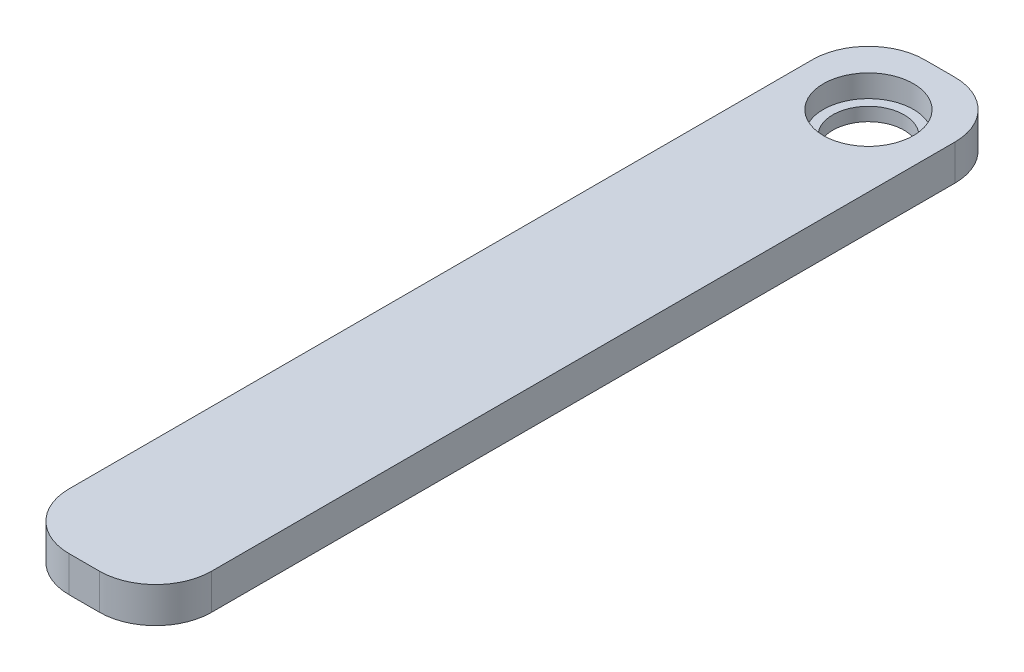
ISO-10303-21;
HEADER;
FILE_DESCRIPTION(('STEP AP214'),'2;1');
FILE_NAME('part.step','',(''),(''),'','','');
FILE_SCHEMA(('AUTOMOTIVE_DESIGN { 1 0 10303 214 1 1 1 1 }'));
ENDSEC;
DATA;
#1=APPLICATION_CONTEXT('core data for automotive mechanical design processes');
#2=APPLICATION_PROTOCOL_DEFINITION('international standard','automotive_design',2000,#1);
#3=PRODUCT_CONTEXT('',#1,'mechanical');
#4=PRODUCT('Part','Part','',(#3));
#5=PRODUCT_RELATED_PRODUCT_CATEGORY('part','',(#4));
#6=PRODUCT_DEFINITION_FORMATION('','',#4);
#7=PRODUCT_DEFINITION_CONTEXT('part definition',#1,'design');
#8=PRODUCT_DEFINITION('design','',#6,#7);
#9=PRODUCT_DEFINITION_SHAPE('','',#8);
#10=(LENGTH_UNIT() NAMED_UNIT(*) SI_UNIT(.MILLI.,.METRE.));
#11=(NAMED_UNIT(*) PLANE_ANGLE_UNIT() SI_UNIT($,.RADIAN.));
#12=(NAMED_UNIT(*) SI_UNIT($,.STERADIAN.) SOLID_ANGLE_UNIT());
#13=UNCERTAINTY_MEASURE_WITH_UNIT(LENGTH_MEASURE(1.E-05),#10,'distance_accuracy_value','');
#14=(GEOMETRIC_REPRESENTATION_CONTEXT(3) GLOBAL_UNCERTAINTY_ASSIGNED_CONTEXT((#13)) GLOBAL_UNIT_ASSIGNED_CONTEXT((#10,
#11,#12)) REPRESENTATION_CONTEXT('',''));
#15=CARTESIAN_POINT('',(0.,0.,0.));
#16=DIRECTION('',(0.,0.,1.));
#17=DIRECTION('',(1.,0.,0.));
#18=AXIS2_PLACEMENT_3D('',#15,#16,#17);
#19=CARTESIAN_POINT('',(0.,6.35,0.));
#20=DIRECTION('',(1.,0.,0.));
#21=DIRECTION('',(0.,0.,-1.));
#22=AXIS2_PLACEMENT_3D('',#19,#20,#21);
#23=PLANE('',#22);
#24=DIRECTION('',(0.,0.,1.));
#25=VECTOR('',#24,1.);
#26=CARTESIAN_POINT('',(0.,0.,0.));
#27=LINE('',#26,#25);
#28=CARTESIAN_POINT('',(0.,0.,-142.4));
#29=VERTEX_POINT('',#28);
#30=CARTESIAN_POINT('',(0.,0.,-9.99999999999999));
#31=VERTEX_POINT('',#30);
#32=EDGE_CURVE('E184',#29,#31,#27,.T.);
#33=ORIENTED_EDGE('',*,*,#32,.T.);
#34=DIRECTION('',(0.,-1.,0.));
#35=VECTOR('',#34,1.);
#36=CARTESIAN_POINT('',(0.,6.35,-10.));
#37=LINE('',#36,#35);
#38=CARTESIAN_POINT('',(0.,6.35,-9.99999999999999));
#39=VERTEX_POINT('',#38);
#40=EDGE_CURVE('E150',#31,#39,#37,.F.);
#41=ORIENTED_EDGE('',*,*,#40,.T.);
#42=DIRECTION('',(0.,0.,1.));
#43=VECTOR('',#42,1.);
#44=CARTESIAN_POINT('',(0.,6.35,0.));
#45=LINE('',#44,#43);
#46=CARTESIAN_POINT('',(0.,6.35,-142.4));
#47=VERTEX_POINT('',#46);
#48=EDGE_CURVE('E182',#47,#39,#45,.T.);
#49=ORIENTED_EDGE('',*,*,#48,.F.);
#50=DIRECTION('',(0.,-1.,0.));
#51=VECTOR('',#50,1.);
#52=CARTESIAN_POINT('',(0.,6.35,-142.4));
#53=LINE('',#52,#51);
#54=EDGE_CURVE('E147',#47,#29,#53,.T.);
#55=ORIENTED_EDGE('',*,*,#54,.T.);
#56=EDGE_LOOP('',(#33,#41,#49,#55));
#57=FACE_BOUND('',#56,.T.);
#58=ADVANCED_FACE('F35',(#57),#23,.F.);
#59=CARTESIAN_POINT('',(0.,6.35,0.));
#60=DIRECTION('',(0.,0.,-1.));
#61=DIRECTION('',(-1.,0.,0.));
#62=AXIS2_PLACEMENT_3D('',#59,#60,#61);
#63=PLANE('',#62);
#64=DIRECTION('',(1.,0.,0.));
#65=VECTOR('',#64,1.);
#66=CARTESIAN_POINT('',(0.,6.35,0.));
#67=LINE('',#66,#65);
#68=CARTESIAN_POINT('',(10.,6.35,0.));
#69=VERTEX_POINT('',#68);
#70=CARTESIAN_POINT('',(15.4,6.35,0.));
#71=VERTEX_POINT('',#70);
#72=EDGE_CURVE('E193',#69,#71,#67,.T.);
#73=ORIENTED_EDGE('',*,*,#72,.F.);
#74=DIRECTION('',(0.,-1.,0.));
#75=VECTOR('',#74,1.);
#76=CARTESIAN_POINT('',(10.,6.35,0.));
#77=LINE('',#76,#75);
#78=CARTESIAN_POINT('',(10.,0.,0.));
#79=VERTEX_POINT('',#78);
#80=EDGE_CURVE('E133',#69,#79,#77,.T.);
#81=ORIENTED_EDGE('',*,*,#80,.T.);
#82=DIRECTION('',(1.,0.,0.));
#83=VECTOR('',#82,1.);
#84=CARTESIAN_POINT('',(0.,0.,0.));
#85=LINE('',#84,#83);
#86=CARTESIAN_POINT('',(15.4,0.,0.));
#87=VERTEX_POINT('',#86);
#88=EDGE_CURVE('E180',#79,#87,#85,.T.);
#89=ORIENTED_EDGE('',*,*,#88,.T.);
#90=DIRECTION('',(0.,-1.,0.));
#91=VECTOR('',#90,1.);
#92=CARTESIAN_POINT('',(15.4,6.35,0.));
#93=LINE('',#92,#91);
#94=EDGE_CURVE('E131',#87,#71,#93,.F.);
#95=ORIENTED_EDGE('',*,*,#94,.T.);
#96=EDGE_LOOP('',(#73,#81,#89,#95));
#97=FACE_BOUND('',#96,.T.);
#98=ADVANCED_FACE('F222',(#97),#63,.F.);
#99=CARTESIAN_POINT('',(25.4,6.35,0.));
#100=DIRECTION('',(-1.,0.,0.));
#101=DIRECTION('',(0.,0.,1.));
#102=AXIS2_PLACEMENT_3D('',#99,#100,#101);
#103=PLANE('',#102);
#104=DIRECTION('',(0.,0.,-1.));
#105=VECTOR('',#104,1.);
#106=CARTESIAN_POINT('',(25.4,6.35,0.));
#107=LINE('',#106,#105);
#108=CARTESIAN_POINT('',(25.4,6.35,-10.));
#109=VERTEX_POINT('',#108);
#110=CARTESIAN_POINT('',(25.4,6.35,-142.4));
#111=VERTEX_POINT('',#110);
#112=EDGE_CURVE('E171',#109,#111,#107,.T.);
#113=ORIENTED_EDGE('',*,*,#112,.F.);
#114=DIRECTION('',(0.,-1.,0.));
#115=VECTOR('',#114,1.);
#116=CARTESIAN_POINT('',(25.4,6.35,-10.));
#117=LINE('',#116,#115);
#118=CARTESIAN_POINT('',(25.4,0.,-10.));
#119=VERTEX_POINT('',#118);
#120=EDGE_CURVE('E161',#109,#119,#117,.T.);
#121=ORIENTED_EDGE('',*,*,#120,.T.);
#122=DIRECTION('',(0.,0.,-1.));
#123=VECTOR('',#122,1.);
#124=CARTESIAN_POINT('',(25.4,0.,0.));
#125=LINE('',#124,#123);
#126=CARTESIAN_POINT('',(25.4,0.,-142.4));
#127=VERTEX_POINT('',#126);
#128=EDGE_CURVE('E169',#119,#127,#125,.T.);
#129=ORIENTED_EDGE('',*,*,#128,.T.);
#130=DIRECTION('',(0.,-1.,0.));
#131=VECTOR('',#130,1.);
#132=CARTESIAN_POINT('',(25.4,6.35,-142.4));
#133=LINE('',#132,#131);
#134=EDGE_CURVE('E159',#127,#111,#133,.F.);
#135=ORIENTED_EDGE('',*,*,#134,.T.);
#136=EDGE_LOOP('',(#113,#121,#129,#135));
#137=FACE_BOUND('',#136,.T.);
#138=ADVANCED_FACE('F168',(#137),#103,.F.);
#139=CARTESIAN_POINT('',(0.,6.35,-152.4));
#140=DIRECTION('',(0.,0.,1.));
#141=DIRECTION('',(1.,0.,0.));
#142=AXIS2_PLACEMENT_3D('',#139,#140,#141);
#143=PLANE('',#142);
#144=DIRECTION('',(-1.,0.,0.));
#145=VECTOR('',#144,1.);
#146=CARTESIAN_POINT('',(0.,6.35,-152.4));
#147=LINE('',#146,#145);
#148=CARTESIAN_POINT('',(15.4,6.35,-152.4));
#149=VERTEX_POINT('',#148);
#150=CARTESIAN_POINT('',(9.99999999999997,6.35,-152.4));
#151=VERTEX_POINT('',#150);
#152=EDGE_CURVE('E190',#149,#151,#147,.T.);
#153=ORIENTED_EDGE('',*,*,#152,.F.);
#154=DIRECTION('',(0.,-1.,0.));
#155=VECTOR('',#154,1.);
#156=CARTESIAN_POINT('',(15.4,6.35,-152.4));
#157=LINE('',#156,#155);
#158=CARTESIAN_POINT('',(15.4,0.,-152.4));
#159=VERTEX_POINT('',#158);
#160=EDGE_CURVE('E11',#149,#159,#157,.T.);
#161=ORIENTED_EDGE('',*,*,#160,.T.);
#162=DIRECTION('',(-1.,0.,0.));
#163=VECTOR('',#162,1.);
#164=CARTESIAN_POINT('',(0.,0.,-152.4));
#165=LINE('',#164,#163);
#166=CARTESIAN_POINT('',(9.99999999999997,0.,-152.4));
#167=VERTEX_POINT('',#166);
#168=EDGE_CURVE('E179',#159,#167,#165,.T.);
#169=ORIENTED_EDGE('',*,*,#168,.T.);
#170=DIRECTION('',(0.,-1.,0.));
#171=VECTOR('',#170,1.);
#172=CARTESIAN_POINT('',(9.99999999999997,6.35,-152.4));
#173=LINE('',#172,#171);
#174=EDGE_CURVE('E43',#167,#151,#173,.F.);
#175=ORIENTED_EDGE('',*,*,#174,.T.);
#176=EDGE_LOOP('',(#153,#161,#169,#175));
#177=FACE_BOUND('',#176,.T.);
#178=ADVANCED_FACE('F228',(#177),#143,.F.);
#179=CARTESIAN_POINT('',(0.,6.35,0.));
#180=DIRECTION('',(0.,-1.,0.));
#181=DIRECTION('',(0.,0.,-1.));
#182=AXIS2_PLACEMENT_3D('',#179,#180,#181);
#183=PLANE('',#182);
#184=ORIENTED_EDGE('',*,*,#48,.T.);
#185=CARTESIAN_POINT('',(10.,6.35,-10.));
#186=DIRECTION('',(0.,-1.,0.));
#187=DIRECTION('',(0.,0.,-1.));
#188=AXIS2_PLACEMENT_3D('',#185,#186,#187);
#189=CIRCLE('',#188,10.);
#190=EDGE_CURVE('E157',#39,#69,#189,.F.);
#191=ORIENTED_EDGE('',*,*,#190,.T.);
#192=ORIENTED_EDGE('',*,*,#72,.T.);
#193=CARTESIAN_POINT('',(15.4,6.35,-10.));
#194=DIRECTION('',(0.,-1.,0.));
#195=DIRECTION('',(0.,0.,-1.));
#196=AXIS2_PLACEMENT_3D('',#193,#194,#195);
#197=CIRCLE('',#196,10.);
#198=EDGE_CURVE('E155',#71,#109,#197,.F.);
#199=ORIENTED_EDGE('',*,*,#198,.T.);
#200=ORIENTED_EDGE('',*,*,#112,.T.);
#201=CARTESIAN_POINT('',(15.4,6.35,-142.4));
#202=DIRECTION('',(0.,-1.,0.));
#203=DIRECTION('',(0.,0.,-1.));
#204=AXIS2_PLACEMENT_3D('',#201,#202,#203);
#205=CIRCLE('',#204,10.);
#206=EDGE_CURVE('E56',#111,#149,#205,.F.);
#207=ORIENTED_EDGE('',*,*,#206,.T.);
#208=ORIENTED_EDGE('',*,*,#152,.T.);
#209=CARTESIAN_POINT('',(9.99999999999997,6.35,-142.4));
#210=DIRECTION('',(0.,-1.,0.));
#211=DIRECTION('',(0.,0.,-1.));
#212=AXIS2_PLACEMENT_3D('',#209,#210,#211);
#213=CIRCLE('',#212,10.);
#214=EDGE_CURVE('E152',#151,#47,#213,.F.);
#215=ORIENTED_EDGE('',*,*,#214,.T.);
#216=EDGE_LOOP('',(#184,#191,#192,#199,#200,#207,#208,#215));
#217=FACE_BOUND('',#216,.T.);
#218=CARTESIAN_POINT('',(12.7,6.35,-139.7));
#219=DIRECTION('',(0.,1.,0.));
#220=DIRECTION('',(0.,0.,1.));
#221=AXIS2_PLACEMENT_3D('',#218,#219,#220);
#222=CIRCLE('',#221,8.016875);
#223=CARTESIAN_POINT('',(12.7,6.35,-131.683125));
#224=VERTEX_POINT('',#223);
#225=EDGE_CURVE('E202',#224,#224,#222,.T.);
#226=ORIENTED_EDGE('',*,*,#225,.F.);
#227=EDGE_LOOP('',(#226));
#228=FACE_BOUND('',#227,.T.);
#229=ADVANCED_FACE('F215',(#217,#228),#183,.F.);
#230=CARTESIAN_POINT('',(0.,0.,0.));
#231=DIRECTION('',(0.,-1.,0.));
#232=DIRECTION('',(0.,0.,-1.));
#233=AXIS2_PLACEMENT_3D('',#230,#231,#232);
#234=PLANE('',#233);
#235=CARTESIAN_POINT('',(12.7,0.,-6.35));
#236=DIRECTION('',(0.,-1.,0.));
#237=DIRECTION('',(0.,0.,-1.));
#238=AXIS2_PLACEMENT_3D('',#235,#236,#237);
#239=CIRCLE('',#238,3.429);
#240=CARTESIAN_POINT('',(15.1611800503011,0.,-8.7376));
#241=VERTEX_POINT('',#240);
#242=CARTESIAN_POINT('',(10.2388199496989,0.,-8.7376));
#243=VERTEX_POINT('',#242);
#244=EDGE_CURVE('E188',#241,#243,#239,.T.);
#245=ORIENTED_EDGE('',*,*,#244,.F.);
#246=DIRECTION('',(1.,0.,0.));
#247=VECTOR('',#246,1.);
#248=CARTESIAN_POINT('',(17.9251449243623,0.,-8.7376));
#249=LINE('',#248,#247);
#250=EDGE_CURVE('E120',#243,#241,#249,.T.);
#251=ORIENTED_EDGE('',*,*,#250,.F.);
#252=EDGE_LOOP('',(#245,#251));
#253=FACE_BOUND('',#252,.T.);
#254=CARTESIAN_POINT('',(12.7,0.,-139.7));
#255=DIRECTION('',(0.,1.,0.));
#256=DIRECTION('',(0.,0.,1.));
#257=AXIS2_PLACEMENT_3D('',#254,#255,#256);
#258=CIRCLE('',#257,6.35);
#259=CARTESIAN_POINT('',(12.7,0.,-133.35));
#260=VERTEX_POINT('',#259);
#261=EDGE_CURVE('E207',#260,#260,#258,.T.);
#262=ORIENTED_EDGE('',*,*,#261,.T.);
#263=EDGE_LOOP('',(#262));
#264=FACE_BOUND('',#263,.T.);
#265=ORIENTED_EDGE('',*,*,#88,.F.);
#266=CARTESIAN_POINT('',(10.,0.,-10.));
#267=DIRECTION('',(0.,-1.,0.));
#268=DIRECTION('',(0.,0.,-1.));
#269=AXIS2_PLACEMENT_3D('',#266,#267,#268);
#270=CIRCLE('',#269,10.);
#271=EDGE_CURVE('E145',#79,#31,#270,.T.);
#272=ORIENTED_EDGE('',*,*,#271,.T.);
#273=ORIENTED_EDGE('',*,*,#32,.F.);
#274=CARTESIAN_POINT('',(9.99999999999997,0.,-142.4));
#275=DIRECTION('',(0.,-1.,0.));
#276=DIRECTION('',(0.,0.,-1.));
#277=AXIS2_PLACEMENT_3D('',#274,#275,#276);
#278=CIRCLE('',#277,10.);
#279=EDGE_CURVE('E139',#29,#167,#278,.T.);
#280=ORIENTED_EDGE('',*,*,#279,.T.);
#281=ORIENTED_EDGE('',*,*,#168,.F.);
#282=CARTESIAN_POINT('',(15.4,0.,-142.4));
#283=DIRECTION('',(0.,-1.,0.));
#284=DIRECTION('',(0.,0.,-1.));
#285=AXIS2_PLACEMENT_3D('',#282,#283,#284);
#286=CIRCLE('',#285,10.);
#287=EDGE_CURVE('E141',#159,#127,#286,.T.);
#288=ORIENTED_EDGE('',*,*,#287,.T.);
#289=ORIENTED_EDGE('',*,*,#128,.F.);
#290=CARTESIAN_POINT('',(15.4,0.,-10.));
#291=DIRECTION('',(0.,-1.,0.));
#292=DIRECTION('',(0.,0.,-1.));
#293=AXIS2_PLACEMENT_3D('',#290,#291,#292);
#294=CIRCLE('',#293,10.);
#295=EDGE_CURVE('E143',#119,#87,#294,.T.);
#296=ORIENTED_EDGE('',*,*,#295,.T.);
#297=EDGE_LOOP('',(#265,#272,#273,#280,#281,#288,#289,#296));
#298=FACE_BOUND('',#297,.T.);
#299=ADVANCED_FACE('F176',(#253,#264,#298),#234,.T.);
#300=CARTESIAN_POINT('',(12.7,2.38125,-139.7));
#301=DIRECTION('',(0.,1.,0.));
#302=DIRECTION('',(0.,0.,1.));
#303=AXIS2_PLACEMENT_3D('',#300,#301,#302);
#304=CYLINDRICAL_SURFACE('',#303,8.016875);
#305=CARTESIAN_POINT('',(12.7,2.38125,-139.7));
#306=DIRECTION('',(0.,1.,0.));
#307=DIRECTION('',(0.,0.,1.));
#308=AXIS2_PLACEMENT_3D('',#305,#306,#307);
#309=CIRCLE('',#308,8.016875);
#310=CARTESIAN_POINT('',(12.7,2.38125,-131.683125));
#311=VERTEX_POINT('',#310);
#312=EDGE_CURVE('E197',#311,#311,#309,.T.);
#313=ORIENTED_EDGE('',*,*,#312,.F.);
#314=EDGE_LOOP('',(#313));
#315=FACE_BOUND('',#314,.T.);
#316=ORIENTED_EDGE('',*,*,#225,.T.);
#317=EDGE_LOOP('',(#316));
#318=FACE_BOUND('',#317,.T.);
#319=ADVANCED_FACE('F265',(#315,#318),#304,.F.);
#320=CARTESIAN_POINT('',(12.7,2.38125,-139.7));
#321=DIRECTION('',(0.,1.,0.));
#322=DIRECTION('',(0.,0.,1.));
#323=AXIS2_PLACEMENT_3D('',#320,#321,#322);
#324=PLANE('',#323);
#325=CARTESIAN_POINT('',(12.7,2.38125,-139.7));
#326=DIRECTION('',(0.,1.,0.));
#327=DIRECTION('',(0.,0.,1.));
#328=AXIS2_PLACEMENT_3D('',#325,#326,#327);
#329=CIRCLE('',#328,6.35);
#330=CARTESIAN_POINT('',(12.7,2.38125,-133.35));
#331=VERTEX_POINT('',#330);
#332=EDGE_CURVE('E189',#331,#331,#329,.T.);
#333=ORIENTED_EDGE('',*,*,#332,.F.);
#334=EDGE_LOOP('',(#333));
#335=FACE_BOUND('',#334,.T.);
#336=ORIENTED_EDGE('',*,*,#312,.T.);
#337=EDGE_LOOP('',(#336));
#338=FACE_BOUND('',#337,.T.);
#339=ADVANCED_FACE('F261',(#335,#338),#324,.T.);
#340=CARTESIAN_POINT('',(12.7,0.,-139.7));
#341=DIRECTION('',(0.,1.,0.));
#342=DIRECTION('',(0.,0.,1.));
#343=AXIS2_PLACEMENT_3D('',#340,#341,#342);
#344=CYLINDRICAL_SURFACE('',#343,6.35);
#345=ORIENTED_EDGE('',*,*,#261,.F.);
#346=EDGE_LOOP('',(#345));
#347=FACE_BOUND('',#346,.T.);
#348=ORIENTED_EDGE('',*,*,#332,.T.);
#349=EDGE_LOOP('',(#348));
#350=FACE_BOUND('',#349,.T.);
#351=ADVANCED_FACE('F258',(#347,#350),#344,.F.);
#352=CARTESIAN_POINT('',(12.7,-1.27,-6.35));
#353=DIRECTION('',(0.,1.,0.));
#354=DIRECTION('',(0.,0.,1.));
#355=AXIS2_PLACEMENT_3D('',#352,#353,#354);
#356=CYLINDRICAL_SURFACE('',#355,3.429);
#357=DIRECTION('',(0.,1.,0.));
#358=VECTOR('',#357,1.);
#359=CARTESIAN_POINT('',(10.2388199496989,-1.27,-8.7376));
#360=LINE('',#359,#358);
#361=CARTESIAN_POINT('',(10.2388199496989,5.08,-8.7376));
#362=VERTEX_POINT('',#361);
#363=EDGE_CURVE('E123',#243,#362,#360,.T.);
#364=ORIENTED_EDGE('',*,*,#363,.T.);
#365=CARTESIAN_POINT('',(12.7,5.08,-6.35));
#366=DIRECTION('',(0.,-1.,0.));
#367=DIRECTION('',(0.,0.,-1.));
#368=AXIS2_PLACEMENT_3D('',#365,#366,#367);
#369=CIRCLE('',#368,3.429);
#370=CARTESIAN_POINT('',(15.1611800503011,5.08,-8.7376));
#371=VERTEX_POINT('',#370);
#372=EDGE_CURVE('E126',#362,#371,#369,.F.);
#373=ORIENTED_EDGE('',*,*,#372,.T.);
#374=DIRECTION('',(0.,1.,0.));
#375=VECTOR('',#374,1.);
#376=CARTESIAN_POINT('',(15.1611800503011,-1.27,-8.7376));
#377=LINE('',#376,#375);
#378=EDGE_CURVE('E112',#371,#241,#377,.F.);
#379=ORIENTED_EDGE('',*,*,#378,.T.);
#380=ORIENTED_EDGE('',*,*,#244,.T.);
#381=EDGE_LOOP('',(#364,#373,#379,#380));
#382=FACE_BOUND('',#381,.T.);
#383=ADVANCED_FACE('F127',(#382),#356,.F.);
#384=CARTESIAN_POINT('',(17.9251449243623,0.,-8.7376));
#385=DIRECTION('',(0.,0.,1.));
#386=DIRECTION('',(1.,0.,0.));
#387=AXIS2_PLACEMENT_3D('',#384,#385,#386);
#388=PLANE('',#387);
#389=DIRECTION('',(1.,0.,0.));
#390=VECTOR('',#389,1.);
#391=CARTESIAN_POINT('',(17.9251449243623,5.08,-8.7376));
#392=LINE('',#391,#390);
#393=EDGE_CURVE('E117',#362,#371,#392,.T.);
#394=ORIENTED_EDGE('',*,*,#393,.F.);
#395=ORIENTED_EDGE('',*,*,#363,.F.);
#396=ORIENTED_EDGE('',*,*,#250,.T.);
#397=ORIENTED_EDGE('',*,*,#378,.F.);
#398=EDGE_LOOP('',(#394,#395,#396,#397));
#399=FACE_BOUND('',#398,.T.);
#400=ADVANCED_FACE('F114',(#399),#388,.T.);
#401=CARTESIAN_POINT('',(0.,5.08,0.));
#402=DIRECTION('',(0.,-1.,0.));
#403=DIRECTION('',(0.,0.,-1.));
#404=AXIS2_PLACEMENT_3D('',#401,#402,#403);
#405=PLANE('',#404);
#406=ORIENTED_EDGE('',*,*,#372,.F.);
#407=ORIENTED_EDGE('',*,*,#393,.T.);
#408=EDGE_LOOP('',(#406,#407));
#409=FACE_BOUND('',#408,.T.);
#410=ADVANCED_FACE('F130',(#409),#405,.T.);
#411=CARTESIAN_POINT('',(10.,6.35,-10.));
#412=DIRECTION('',(0.,-1.,0.));
#413=DIRECTION('',(0.,0.,-1.));
#414=AXIS2_PLACEMENT_3D('',#411,#412,#413);
#415=CYLINDRICAL_SURFACE('',#414,10.);
#416=ORIENTED_EDGE('',*,*,#190,.F.);
#417=ORIENTED_EDGE('',*,*,#40,.F.);
#418=ORIENTED_EDGE('',*,*,#271,.F.);
#419=ORIENTED_EDGE('',*,*,#80,.F.);
#420=EDGE_LOOP('',(#416,#417,#418,#419));
#421=FACE_BOUND('',#420,.T.);
#422=ADVANCED_FACE('F224',(#421),#415,.T.);
#423=CARTESIAN_POINT('',(15.4,6.35,-10.));
#424=DIRECTION('',(0.,-1.,0.));
#425=DIRECTION('',(0.,0.,-1.));
#426=AXIS2_PLACEMENT_3D('',#423,#424,#425);
#427=CYLINDRICAL_SURFACE('',#426,10.);
#428=ORIENTED_EDGE('',*,*,#198,.F.);
#429=ORIENTED_EDGE('',*,*,#94,.F.);
#430=ORIENTED_EDGE('',*,*,#295,.F.);
#431=ORIENTED_EDGE('',*,*,#120,.F.);
#432=EDGE_LOOP('',(#428,#429,#430,#431));
#433=FACE_BOUND('',#432,.T.);
#434=ADVANCED_FACE('F221',(#433),#427,.T.);
#435=CARTESIAN_POINT('',(15.4,6.35,-142.4));
#436=DIRECTION('',(0.,-1.,0.));
#437=DIRECTION('',(0.,0.,-1.));
#438=AXIS2_PLACEMENT_3D('',#435,#436,#437);
#439=CYLINDRICAL_SURFACE('',#438,10.);
#440=ORIENTED_EDGE('',*,*,#206,.F.);
#441=ORIENTED_EDGE('',*,*,#134,.F.);
#442=ORIENTED_EDGE('',*,*,#287,.F.);
#443=ORIENTED_EDGE('',*,*,#160,.F.);
#444=EDGE_LOOP('',(#440,#441,#442,#443));
#445=FACE_BOUND('',#444,.T.);
#446=ADVANCED_FACE('F231',(#445),#439,.T.);
#447=CARTESIAN_POINT('',(9.99999999999997,6.35,-142.4));
#448=DIRECTION('',(0.,-1.,0.));
#449=DIRECTION('',(0.,0.,-1.));
#450=AXIS2_PLACEMENT_3D('',#447,#448,#449);
#451=CYLINDRICAL_SURFACE('',#450,10.);
#452=ORIENTED_EDGE('',*,*,#214,.F.);
#453=ORIENTED_EDGE('',*,*,#174,.F.);
#454=ORIENTED_EDGE('',*,*,#279,.F.);
#455=ORIENTED_EDGE('',*,*,#54,.F.);
#456=EDGE_LOOP('',(#452,#453,#454,#455));
#457=FACE_BOUND('',#456,.T.);
#458=ADVANCED_FACE('F37',(#457),#451,.T.);
#459=CLOSED_SHELL('',(#58,#98,#138,#178,#229,#299,#319,#339,#351,#383,#400,#410,#422,#434,#446,#458));
#460=MANIFOLD_SOLID_BREP('B2',#459);
#461=ADVANCED_BREP_SHAPE_REPRESENTATION('',(#18,#460),#14);
#462=SHAPE_DEFINITION_REPRESENTATION(#9,#461);
ENDSEC;
END-ISO-10303-21;
